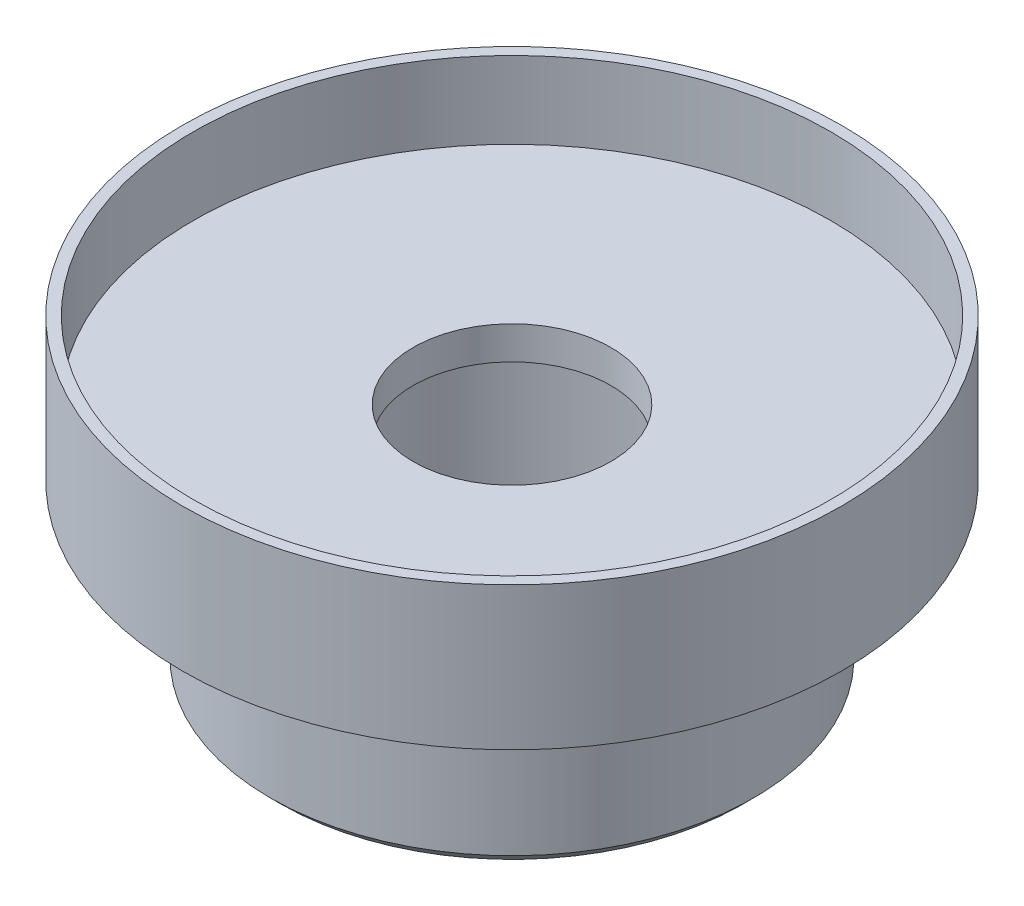
ISO-10303-21;
HEADER;
FILE_DESCRIPTION(('STEP AP214'),'2;1');
FILE_NAME('part.step','',(''),(''),'','','');
FILE_SCHEMA(('AUTOMOTIVE_DESIGN { 1 0 10303 214 1 1 1 1 }'));
ENDSEC;
DATA;
#1=APPLICATION_CONTEXT('core data for automotive mechanical design processes');
#2=APPLICATION_PROTOCOL_DEFINITION('international standard','automotive_design',2000,#1);
#3=PRODUCT_CONTEXT('',#1,'mechanical');
#4=PRODUCT('Part','Part','',(#3));
#5=PRODUCT_RELATED_PRODUCT_CATEGORY('part','',(#4));
#6=PRODUCT_DEFINITION_FORMATION('','',#4);
#7=PRODUCT_DEFINITION_CONTEXT('part definition',#1,'design');
#8=PRODUCT_DEFINITION('design','',#6,#7);
#9=PRODUCT_DEFINITION_SHAPE('','',#8);
#10=(LENGTH_UNIT() NAMED_UNIT(*) SI_UNIT(.MILLI.,.METRE.));
#11=(NAMED_UNIT(*) PLANE_ANGLE_UNIT() SI_UNIT($,.RADIAN.));
#12=(NAMED_UNIT(*) SI_UNIT($,.STERADIAN.) SOLID_ANGLE_UNIT());
#13=UNCERTAINTY_MEASURE_WITH_UNIT(LENGTH_MEASURE(1.E-05),#10,'distance_accuracy_value','');
#14=(GEOMETRIC_REPRESENTATION_CONTEXT(3) GLOBAL_UNCERTAINTY_ASSIGNED_CONTEXT((#13)) GLOBAL_UNIT_ASSIGNED_CONTEXT((#10,
#11,#12)) REPRESENTATION_CONTEXT('',''));
#15=CARTESIAN_POINT('',(0.,0.,0.));
#16=DIRECTION('',(0.,0.,1.));
#17=DIRECTION('',(1.,0.,0.));
#18=AXIS2_PLACEMENT_3D('',#15,#16,#17);
#19=CARTESIAN_POINT('',(0.,7.5,0.));
#20=DIRECTION('',(0.,-1.,0.));
#21=DIRECTION('',(0.,0.,-1.));
#22=AXIS2_PLACEMENT_3D('',#19,#20,#21);
#23=CYLINDRICAL_SURFACE('',#22,11.);
#24=CARTESIAN_POINT('',(0.,6.5,0.));
#25=DIRECTION('',(0.,1.,0.));
#26=DIRECTION('',(0.,0.,1.));
#27=AXIS2_PLACEMENT_3D('',#24,#25,#26);
#28=CIRCLE('',#27,11.);
#29=CARTESIAN_POINT('',(0.,6.5,11.));
#30=VERTEX_POINT('',#29);
#31=EDGE_CURVE('E10',#30,#30,#28,.F.);
#32=ORIENTED_EDGE('',*,*,#31,.T.);
#33=EDGE_LOOP('',(#32));
#34=FACE_BOUND('',#33,.T.);
#35=CARTESIAN_POINT('',(0.,0.499999999999999,0.));
#36=DIRECTION('',(0.,1.,0.));
#37=DIRECTION('',(0.,0.,1.));
#38=AXIS2_PLACEMENT_3D('',#35,#36,#37);
#39=CIRCLE('',#38,11.);
#40=CARTESIAN_POINT('',(0.,0.499999999999999,11.));
#41=VERTEX_POINT('',#40);
#42=EDGE_CURVE('E61',#41,#41,#39,.T.);
#43=ORIENTED_EDGE('',*,*,#42,.T.);
#44=EDGE_LOOP('',(#43));
#45=FACE_BOUND('',#44,.T.);
#46=ADVANCED_FACE('F45',(#34,#45),#23,.T.);
#47=CARTESIAN_POINT('',(0.,0.,0.));
#48=DIRECTION('',(0.,1.,0.));
#49=DIRECTION('',(0.,0.,1.));
#50=AXIS2_PLACEMENT_3D('',#47,#48,#49);
#51=PLANE('',#50);
#52=CARTESIAN_POINT('',(0.,0.,0.));
#53=DIRECTION('',(0.,1.,0.));
#54=DIRECTION('',(0.,0.,1.));
#55=AXIS2_PLACEMENT_3D('',#52,#53,#54);
#56=CIRCLE('',#55,8.);
#57=CARTESIAN_POINT('',(0.,0.,8.));
#58=VERTEX_POINT('',#57);
#59=EDGE_CURVE('E90',#58,#58,#56,.T.);
#60=ORIENTED_EDGE('',*,*,#59,.T.);
#61=EDGE_LOOP('',(#60));
#62=FACE_BOUND('',#61,.T.);
#63=CARTESIAN_POINT('',(0.,0.,0.));
#64=DIRECTION('',(0.,1.,0.));
#65=DIRECTION('',(0.,0.,1.));
#66=AXIS2_PLACEMENT_3D('',#63,#64,#65);
#67=CIRCLE('',#66,10.5);
#68=CARTESIAN_POINT('',(0.,0.,10.5));
#69=VERTEX_POINT('',#68);
#70=EDGE_CURVE('E57',#69,#69,#67,.F.);
#71=ORIENTED_EDGE('',*,*,#70,.T.);
#72=EDGE_LOOP('',(#71));
#73=FACE_BOUND('',#72,.T.);
#74=ADVANCED_FACE('F97',(#62,#73),#51,.F.);
#75=CARTESIAN_POINT('',(0.,14.,0.));
#76=DIRECTION('',(0.,-1.,0.));
#77=DIRECTION('',(0.,0.,-1.));
#78=AXIS2_PLACEMENT_3D('',#75,#76,#77);
#79=CYLINDRICAL_SURFACE('',#78,15.);
#80=CARTESIAN_POINT('',(0.,14.,0.));
#81=DIRECTION('',(0.,1.,0.));
#82=DIRECTION('',(0.,0.,1.));
#83=AXIS2_PLACEMENT_3D('',#80,#81,#82);
#84=CIRCLE('',#83,15.);
#85=CARTESIAN_POINT('',(0.,14.,-15.));
#86=VERTEX_POINT('',#85);
#87=EDGE_CURVE('E66',#86,#86,#84,.T.);
#88=CARTESIAN_POINT('',(0.,7.5,0.));
#89=DIRECTION('',(0.,1.,0.));
#90=DIRECTION('',(0.,0.,1.));
#91=AXIS2_PLACEMENT_3D('',#88,#89,#90);
#92=CIRCLE('',#91,15.);
#93=CARTESIAN_POINT('',(0.,7.5,-15.));
#94=VERTEX_POINT('',#93);
#95=EDGE_CURVE('E67',#94,#94,#92,.T.);
#96=CARTESIAN_POINT('',(0.,14.,-15.));
#97=CARTESIAN_POINT('',(0.,13.9322916666667,-15.));
#98=CARTESIAN_POINT('',(0.,13.8645833333333,-15.));
#99=CARTESIAN_POINT('',(0.,13.7291666666667,-15.));
#100=CARTESIAN_POINT('',(0.,13.6614583333333,-15.));
#101=CARTESIAN_POINT('',(0.,13.5260416666667,-15.));
#102=CARTESIAN_POINT('',(0.,13.4583333333333,-15.));
#103=CARTESIAN_POINT('',(0.,13.3229166666667,-15.));
#104=CARTESIAN_POINT('',(0.,13.2552083333333,-15.));
#105=CARTESIAN_POINT('',(0.,13.1197916666667,-15.));
#106=CARTESIAN_POINT('',(0.,13.0520833333333,-15.));
#107=CARTESIAN_POINT('',(0.,12.9166666666667,-15.));
#108=CARTESIAN_POINT('',(0.,12.8489583333333,-15.));
#109=CARTESIAN_POINT('',(0.,12.7135416666667,-15.));
#110=CARTESIAN_POINT('',(0.,12.6458333333333,-15.));
#111=CARTESIAN_POINT('',(0.,12.5104166666667,-15.));
#112=CARTESIAN_POINT('',(0.,12.4427083333333,-15.));
#113=CARTESIAN_POINT('',(0.,12.3072916666667,-15.));
#114=CARTESIAN_POINT('',(0.,12.2395833333333,-15.));
#115=CARTESIAN_POINT('',(0.,12.1041666666667,-15.));
#116=CARTESIAN_POINT('',(0.,12.0364583333333,-15.));
#117=CARTESIAN_POINT('',(0.,11.9010416666667,-15.));
#118=CARTESIAN_POINT('',(0.,11.8333333333333,-15.));
#119=CARTESIAN_POINT('',(0.,11.6979166666667,-15.));
#120=CARTESIAN_POINT('',(0.,11.6302083333333,-15.));
#121=CARTESIAN_POINT('',(0.,11.4947916666667,-15.));
#122=CARTESIAN_POINT('',(0.,11.4270833333333,-15.));
#123=CARTESIAN_POINT('',(0.,11.2916666666667,-15.));
#124=CARTESIAN_POINT('',(0.,11.2239583333333,-15.));
#125=CARTESIAN_POINT('',(0.,11.0885416666667,-15.));
#126=CARTESIAN_POINT('',(0.,11.0208333333333,-15.));
#127=CARTESIAN_POINT('',(0.,10.8854166666667,-15.));
#128=CARTESIAN_POINT('',(0.,10.8177083333333,-15.));
#129=CARTESIAN_POINT('',(0.,10.6822916666667,-15.));
#130=CARTESIAN_POINT('',(0.,10.6145833333333,-15.));
#131=CARTESIAN_POINT('',(0.,10.4791666666667,-15.));
#132=CARTESIAN_POINT('',(0.,10.4114583333333,-15.));
#133=CARTESIAN_POINT('',(0.,10.2760416666667,-15.));
#134=CARTESIAN_POINT('',(0.,10.2083333333333,-15.));
#135=CARTESIAN_POINT('',(0.,10.0729166666667,-15.));
#136=CARTESIAN_POINT('',(0.,10.0052083333333,-15.));
#137=CARTESIAN_POINT('',(0.,9.86979166666667,-15.));
#138=CARTESIAN_POINT('',(0.,9.80208333333333,-15.));
#139=CARTESIAN_POINT('',(0.,9.66666666666667,-15.));
#140=CARTESIAN_POINT('',(0.,9.59895833333333,-15.));
#141=CARTESIAN_POINT('',(0.,9.46354166666667,-15.));
#142=CARTESIAN_POINT('',(0.,9.39583333333333,-15.));
#143=CARTESIAN_POINT('',(0.,9.26041666666666,-15.));
#144=CARTESIAN_POINT('',(0.,9.19270833333333,-15.));
#145=CARTESIAN_POINT('',(0.,9.05729166666666,-15.));
#146=CARTESIAN_POINT('',(0.,8.98958333333333,-15.));
#147=CARTESIAN_POINT('',(0.,8.85416666666667,-15.));
#148=CARTESIAN_POINT('',(0.,8.78645833333333,-15.));
#149=CARTESIAN_POINT('',(0.,8.65104166666667,-15.));
#150=CARTESIAN_POINT('',(0.,8.58333333333333,-15.));
#151=CARTESIAN_POINT('',(0.,8.44791666666667,-15.));
#152=CARTESIAN_POINT('',(0.,8.38020833333333,-15.));
#153=CARTESIAN_POINT('',(0.,8.24479166666667,-15.));
#154=CARTESIAN_POINT('',(0.,8.17708333333333,-15.));
#155=CARTESIAN_POINT('',(0.,8.04166666666667,-15.));
#156=CARTESIAN_POINT('',(0.,7.97395833333333,-15.));
#157=CARTESIAN_POINT('',(0.,7.83854166666667,-15.));
#158=CARTESIAN_POINT('',(0.,7.77083333333333,-15.));
#159=CARTESIAN_POINT('',(0.,7.63541666666667,-15.));
#160=CARTESIAN_POINT('',(0.,7.56770833333333,-15.));
#161=CARTESIAN_POINT('',(0.,7.5,-15.));
#162=B_SPLINE_CURVE_WITH_KNOTS('',3,(#96,#97,#98,#99,#100,#101,#102,#103,#104,#105,#106,#107,
#108,#109,#110,#111,#112,#113,#114,#115,#116,#117,#118,#119,#120,#121,#122,#123,#124,#125,#126,
#127,#128,#129,#130,#131,#132,#133,#134,#135,#136,#137,#138,#139,#140,#141,#142,#143,#144,#145,
#146,#147,#148,#149,#150,#151,#152,#153,#154,#155,#156,#157,#158,#159,#160,#161),.UNSPECIFIED.,
.F.,.F.,(4,2,2,2,2,2,2,2,2,2,2,2,2,2,2,2,2,2,2,2,2,2,2,2,2,2,2,2,2,2,2,2,4),(0.,
0.203124999999998,0.406249999999999,0.609374999999999,0.812499999999999,1.015625,1.21875,
1.421875,1.625,1.828125,2.03125,2.234375,2.4375,2.640625,2.84375,3.046875,3.25,3.453125,3.65625,
3.859375,4.0625,4.265625,4.46875,4.671875,4.875,5.078125,5.28125,5.484375,5.6875,5.890625,
6.09375,6.296875,6.5),.UNSPECIFIED.);
#163=EDGE_CURVE('BSEAM120',#86,#94,#162,.T.);
#164=ORIENTED_EDGE('',*,*,#87,.F.);
#165=ORIENTED_EDGE('',*,*,#95,.T.);
#166=ORIENTED_EDGE('',*,*,#163,.T.);
#167=ORIENTED_EDGE('',*,*,#163,.F.);
#168=EDGE_LOOP('',(#164,#166,#165,#167));
#169=FACE_BOUND('',#168,.T.);
#170=ADVANCED_FACE('F120',(#169),#79,.T.);
#171=CARTESIAN_POINT('',(0.,14.,0.));
#172=DIRECTION('',(0.,1.,0.));
#173=DIRECTION('',(0.,0.,1.));
#174=AXIS2_PLACEMENT_3D('',#171,#172,#173);
#175=PLANE('',#174);
#176=CARTESIAN_POINT('',(0.,14.,0.));
#177=DIRECTION('',(0.,1.,0.));
#178=DIRECTION('',(0.,0.,1.));
#179=AXIS2_PLACEMENT_3D('',#176,#177,#178);
#180=CIRCLE('',#179,14.5);
#181=CARTESIAN_POINT('',(0.,14.,14.5));
#182=VERTEX_POINT('',#181);
#183=EDGE_CURVE('E73',#182,#182,#180,.T.);
#184=ORIENTED_EDGE('',*,*,#183,.F.);
#185=EDGE_LOOP('',(#184));
#186=FACE_BOUND('',#185,.T.);
#187=ORIENTED_EDGE('',*,*,#87,.T.);
#188=EDGE_LOOP('',(#187));
#189=FACE_BOUND('',#188,.T.);
#190=ADVANCED_FACE('F136',(#186,#189),#175,.T.);
#191=CARTESIAN_POINT('',(0.,7.5,0.));
#192=DIRECTION('',(0.,1.,0.));
#193=DIRECTION('',(0.,0.,1.));
#194=AXIS2_PLACEMENT_3D('',#191,#192,#193);
#195=PLANE('',#194);
#196=CARTESIAN_POINT('',(0.,7.5,0.));
#197=DIRECTION('',(0.,1.,0.));
#198=DIRECTION('',(0.,0.,1.));
#199=AXIS2_PLACEMENT_3D('',#196,#197,#198);
#200=CIRCLE('',#199,12.);
#201=CARTESIAN_POINT('',(0.,7.5,12.));
#202=VERTEX_POINT('',#201);
#203=EDGE_CURVE('E53',#202,#202,#200,.T.);
#204=ORIENTED_EDGE('',*,*,#203,.T.);
#205=EDGE_LOOP('',(#204));
#206=FACE_BOUND('',#205,.T.);
#207=ORIENTED_EDGE('',*,*,#95,.F.);
#208=EDGE_LOOP('',(#207));
#209=FACE_BOUND('',#208,.T.);
#210=ADVANCED_FACE('F128',(#206,#209),#195,.F.);
#211=CARTESIAN_POINT('',(0.,0.499999999999999,0.));
#212=DIRECTION('',(0.,1.,0.));
#213=DIRECTION('',(0.,0.,1.));
#214=AXIS2_PLACEMENT_3D('',#211,#212,#213);
#215=CONICAL_SURFACE('',#214,11.,0.785398163397448);
#216=ORIENTED_EDGE('',*,*,#70,.F.);
#217=EDGE_LOOP('',(#216));
#218=FACE_BOUND('',#217,.T.);
#219=ORIENTED_EDGE('',*,*,#42,.F.);
#220=EDGE_LOOP('',(#219));
#221=FACE_BOUND('',#220,.T.);
#222=ADVANCED_FACE('F125',(#218,#221),#215,.T.);
#223=CARTESIAN_POINT('',(0.,7.5,0.));
#224=DIRECTION('',(0.,1.,0.));
#225=DIRECTION('',(0.,0.,1.));
#226=AXIS2_PLACEMENT_3D('',#223,#224,#225);
#227=CONICAL_SURFACE('',#226,12.,0.785398163397454);
#228=ORIENTED_EDGE('',*,*,#31,.F.);
#229=EDGE_LOOP('',(#228));
#230=FACE_BOUND('',#229,.T.);
#231=ORIENTED_EDGE('',*,*,#203,.F.);
#232=EDGE_LOOP('',(#231));
#233=FACE_BOUND('',#232,.T.);
#234=ADVANCED_FACE('F48',(#230,#233),#227,.T.);
#235=CARTESIAN_POINT('',(0.,10.5,0.));
#236=DIRECTION('',(0.,1.,0.));
#237=DIRECTION('',(0.,0.,1.));
#238=AXIS2_PLACEMENT_3D('',#235,#236,#237);
#239=CYLINDRICAL_SURFACE('',#238,14.5);
#240=CARTESIAN_POINT('',(0.,10.5,0.));
#241=DIRECTION('',(0.,1.,0.));
#242=DIRECTION('',(0.,0.,1.));
#243=AXIS2_PLACEMENT_3D('',#240,#241,#242);
#244=CIRCLE('',#243,14.5);
#245=CARTESIAN_POINT('',(0.,10.5,14.5));
#246=VERTEX_POINT('',#245);
#247=EDGE_CURVE('E70',#246,#246,#244,.T.);
#248=ORIENTED_EDGE('',*,*,#247,.F.);
#249=EDGE_LOOP('',(#248));
#250=FACE_BOUND('',#249,.T.);
#251=ORIENTED_EDGE('',*,*,#183,.T.);
#252=EDGE_LOOP('',(#251));
#253=FACE_BOUND('',#252,.T.);
#254=ADVANCED_FACE('F134',(#250,#253),#239,.F.);
#255=CARTESIAN_POINT('',(0.,10.5,0.));
#256=DIRECTION('',(0.,1.,0.));
#257=DIRECTION('',(0.,0.,1.));
#258=AXIS2_PLACEMENT_3D('',#255,#256,#257);
#259=PLANE('',#258);
#260=CARTESIAN_POINT('',(0.,10.5,0.));
#261=DIRECTION('',(0.,1.,0.));
#262=DIRECTION('',(0.,0.,1.));
#263=AXIS2_PLACEMENT_3D('',#260,#261,#262);
#264=CIRCLE('',#263,4.5);
#265=CARTESIAN_POINT('',(0.,10.5,4.5));
#266=VERTEX_POINT('',#265);
#267=EDGE_CURVE('E76',#266,#266,#264,.T.);
#268=ORIENTED_EDGE('',*,*,#267,.F.);
#269=EDGE_LOOP('',(#268));
#270=FACE_BOUND('',#269,.T.);
#271=ORIENTED_EDGE('',*,*,#247,.T.);
#272=EDGE_LOOP('',(#271));
#273=FACE_BOUND('',#272,.T.);
#274=ADVANCED_FACE('F189',(#270,#273),#259,.T.);
#275=CARTESIAN_POINT('',(0.,9.,0.));
#276=DIRECTION('',(0.,1.,0.));
#277=DIRECTION('',(0.,0.,1.));
#278=AXIS2_PLACEMENT_3D('',#275,#276,#277);
#279=CYLINDRICAL_SURFACE('',#278,4.5);
#280=CARTESIAN_POINT('',(0.,9.,0.));
#281=DIRECTION('',(0.,1.,0.));
#282=DIRECTION('',(0.,0.,1.));
#283=AXIS2_PLACEMENT_3D('',#280,#281,#282);
#284=CIRCLE('',#283,4.5);
#285=CARTESIAN_POINT('',(0.,9.,4.5));
#286=VERTEX_POINT('',#285);
#287=EDGE_CURVE('E81',#286,#286,#284,.T.);
#288=ORIENTED_EDGE('',*,*,#287,.F.);
#289=EDGE_LOOP('',(#288));
#290=FACE_BOUND('',#289,.T.);
#291=ORIENTED_EDGE('',*,*,#267,.T.);
#292=EDGE_LOOP('',(#291));
#293=FACE_BOUND('',#292,.T.);
#294=ADVANCED_FACE('F198',(#290,#293),#279,.F.);
#295=CARTESIAN_POINT('',(0.,8.,0.));
#296=DIRECTION('',(0.,1.,0.));
#297=DIRECTION('',(0.,0.,1.));
#298=AXIS2_PLACEMENT_3D('',#295,#296,#297);
#299=CYLINDRICAL_SURFACE('',#298,7.);
#300=CARTESIAN_POINT('',(0.,8.,0.));
#301=DIRECTION('',(0.,1.,0.));
#302=DIRECTION('',(0.,0.,1.));
#303=AXIS2_PLACEMENT_3D('',#300,#301,#302);
#304=CIRCLE('',#303,7.);
#305=CARTESIAN_POINT('',(0.,8.,7.));
#306=VERTEX_POINT('',#305);
#307=EDGE_CURVE('E87',#306,#306,#304,.T.);
#308=ORIENTED_EDGE('',*,*,#307,.F.);
#309=EDGE_LOOP('',(#308));
#310=FACE_BOUND('',#309,.T.);
#311=CARTESIAN_POINT('',(0.,9.,0.));
#312=DIRECTION('',(0.,1.,0.));
#313=DIRECTION('',(0.,0.,1.));
#314=AXIS2_PLACEMENT_3D('',#311,#312,#313);
#315=CIRCLE('',#314,7.);
#316=CARTESIAN_POINT('',(0.,9.,7.));
#317=VERTEX_POINT('',#316);
#318=EDGE_CURVE('E84',#317,#317,#315,.T.);
#319=ORIENTED_EDGE('',*,*,#318,.T.);
#320=EDGE_LOOP('',(#319));
#321=FACE_BOUND('',#320,.T.);
#322=ADVANCED_FACE('F208',(#310,#321),#299,.F.);
#323=CARTESIAN_POINT('',(0.,9.,0.));
#324=DIRECTION('',(0.,1.,0.));
#325=DIRECTION('',(0.,0.,1.));
#326=AXIS2_PLACEMENT_3D('',#323,#324,#325);
#327=PLANE('',#326);
#328=ORIENTED_EDGE('',*,*,#287,.T.);
#329=EDGE_LOOP('',(#328));
#330=FACE_BOUND('',#329,.T.);
#331=ORIENTED_EDGE('',*,*,#318,.F.);
#332=EDGE_LOOP('',(#331));
#333=FACE_BOUND('',#332,.T.);
#334=ADVANCED_FACE('F104',(#330,#333),#327,.F.);
#335=CARTESIAN_POINT('',(0.,0.,0.));
#336=DIRECTION('',(0.,1.,0.));
#337=DIRECTION('',(0.,0.,1.));
#338=AXIS2_PLACEMENT_3D('',#335,#336,#337);
#339=CYLINDRICAL_SURFACE('',#338,8.);
#340=ORIENTED_EDGE('',*,*,#59,.F.);
#341=EDGE_LOOP('',(#340));
#342=FACE_BOUND('',#341,.T.);
#343=CARTESIAN_POINT('',(0.,8.,0.));
#344=DIRECTION('',(0.,1.,0.));
#345=DIRECTION('',(0.,0.,1.));
#346=AXIS2_PLACEMENT_3D('',#343,#344,#345);
#347=CIRCLE('',#346,8.);
#348=CARTESIAN_POINT('',(0.,8.,8.));
#349=VERTEX_POINT('',#348);
#350=EDGE_CURVE('E91',#349,#349,#347,.T.);
#351=ORIENTED_EDGE('',*,*,#350,.T.);
#352=EDGE_LOOP('',(#351));
#353=FACE_BOUND('',#352,.T.);
#354=ADVANCED_FACE('F100',(#342,#353),#339,.F.);
#355=CARTESIAN_POINT('',(0.,8.,0.));
#356=DIRECTION('',(0.,1.,0.));
#357=DIRECTION('',(0.,0.,1.));
#358=AXIS2_PLACEMENT_3D('',#355,#356,#357);
#359=PLANE('',#358);
#360=ORIENTED_EDGE('',*,*,#307,.T.);
#361=EDGE_LOOP('',(#360));
#362=FACE_BOUND('',#361,.T.);
#363=ORIENTED_EDGE('',*,*,#350,.F.);
#364=EDGE_LOOP('',(#363));
#365=FACE_BOUND('',#364,.T.);
#366=ADVANCED_FACE('F103',(#362,#365),#359,.F.);
#367=CLOSED_SHELL('',(#46,#74,#170,#190,#210,#222,#234,#254,#274,#294,#322,#334,#354,#366));
#368=MANIFOLD_SOLID_BREP('B2',#367);
#369=ADVANCED_BREP_SHAPE_REPRESENTATION('',(#18,#368),#14);
#370=SHAPE_DEFINITION_REPRESENTATION(#9,#369);
ENDSEC;
END-ISO-10303-21;
